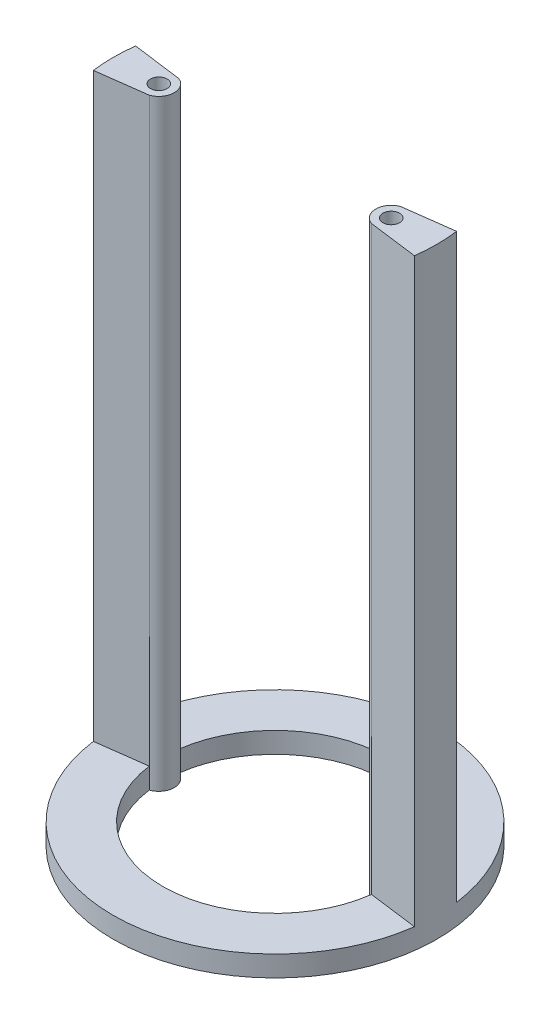
ISO-10303-21;
HEADER;
FILE_DESCRIPTION(('STEP AP214'),'2;1');
FILE_NAME('part.step','',(''),(''),'','','');
FILE_SCHEMA(('AUTOMOTIVE_DESIGN { 1 0 10303 214 1 1 1 1 }'));
ENDSEC;
DATA;
#1=APPLICATION_CONTEXT('core data for automotive mechanical design processes');
#2=APPLICATION_PROTOCOL_DEFINITION('international standard','automotive_design',2000,#1);
#3=PRODUCT_CONTEXT('',#1,'mechanical');
#4=PRODUCT('Part','Part','',(#3));
#5=PRODUCT_RELATED_PRODUCT_CATEGORY('part','',(#4));
#6=PRODUCT_DEFINITION_FORMATION('','',#4);
#7=PRODUCT_DEFINITION_CONTEXT('part definition',#1,'design');
#8=PRODUCT_DEFINITION('design','',#6,#7);
#9=PRODUCT_DEFINITION_SHAPE('','',#8);
#10=(LENGTH_UNIT() NAMED_UNIT(*) SI_UNIT(.MILLI.,.METRE.));
#11=(NAMED_UNIT(*) PLANE_ANGLE_UNIT() SI_UNIT($,.RADIAN.));
#12=(NAMED_UNIT(*) SI_UNIT($,.STERADIAN.) SOLID_ANGLE_UNIT());
#13=UNCERTAINTY_MEASURE_WITH_UNIT(LENGTH_MEASURE(1.E-05),#10,'distance_accuracy_value','');
#14=(GEOMETRIC_REPRESENTATION_CONTEXT(3) GLOBAL_UNCERTAINTY_ASSIGNED_CONTEXT((#13)) GLOBAL_UNIT_ASSIGNED_CONTEXT((#10,
#11,#12)) REPRESENTATION_CONTEXT('',''));
#15=CARTESIAN_POINT('',(0.,0.,0.));
#16=DIRECTION('',(0.,0.,1.));
#17=DIRECTION('',(1.,0.,0.));
#18=AXIS2_PLACEMENT_3D('',#15,#16,#17);
#19=CARTESIAN_POINT('',(0.,0.,0.));
#20=DIRECTION('',(0.,1.,0.));
#21=DIRECTION('',(0.,0.,1.));
#22=AXIS2_PLACEMENT_3D('',#19,#20,#21);
#23=PLANE('',#22);
#24=CARTESIAN_POINT('',(0.,0.,0.));
#25=DIRECTION('',(0.,1.,0.));
#26=DIRECTION('',(0.,0.,1.));
#27=AXIS2_PLACEMENT_3D('',#24,#25,#26);
#28=CIRCLE('',#27,49.53);
#29=CARTESIAN_POINT('',(0.,0.,49.53));
#30=VERTEX_POINT('',#29);
#31=EDGE_CURVE('E38',#30,#30,#28,.T.);
#32=ORIENTED_EDGE('',*,*,#31,.F.);
#33=EDGE_LOOP('',(#32));
#34=FACE_BOUND('',#33,.T.);
#35=CARTESIAN_POINT('',(0.,0.,0.));
#36=DIRECTION('',(0.,1.,0.));
#37=DIRECTION('',(0.,0.,1.));
#38=AXIS2_PLACEMENT_3D('',#35,#36,#37);
#39=CIRCLE('',#38,34.29);
#40=CARTESIAN_POINT('',(-33.996644296508,0.,4.47574313122558));
#41=VERTEX_POINT('',#40);
#42=CARTESIAN_POINT('',(33.996644296508,0.,4.47574313122558));
#43=VERTEX_POINT('',#42);
#44=EDGE_CURVE('E172',#41,#43,#39,.T.);
#45=ORIENTED_EDGE('',*,*,#44,.T.);
#46=CARTESIAN_POINT('',(35.56,0.,0.));
#47=DIRECTION('',(0.,1.,0.));
#48=DIRECTION('',(0.,0.,-1.));
#49=AXIS2_PLACEMENT_3D('',#46,#47,#48);
#50=CIRCLE('',#49,4.74092371087682);
#51=CARTESIAN_POINT('',(33.996644296508,0.,-4.47574313122558));
#52=VERTEX_POINT('',#51);
#53=EDGE_CURVE('E183',#52,#43,#50,.T.);
#54=ORIENTED_EDGE('',*,*,#53,.F.);
#55=CARTESIAN_POINT('',(-33.996644296508,0.,-4.47574313122558));
#56=VERTEX_POINT('',#55);
#57=EDGE_CURVE('E58',#52,#56,#39,.T.);
#58=ORIENTED_EDGE('',*,*,#57,.T.);
#59=CARTESIAN_POINT('',(-35.56,0.,0.));
#60=DIRECTION('',(0.,1.,0.));
#61=DIRECTION('',(0.,0.,1.));
#62=AXIS2_PLACEMENT_3D('',#59,#60,#61);
#63=CIRCLE('',#62,4.74092371087682);
#64=EDGE_CURVE('E182',#41,#56,#63,.T.);
#65=ORIENTED_EDGE('',*,*,#64,.F.);
#66=EDGE_LOOP('',(#45,#54,#58,#65));
#67=FACE_BOUND('',#66,.T.);
#68=CARTESIAN_POINT('',(-35.56,0.,0.));
#69=DIRECTION('',(0.,-1.,0.));
#70=DIRECTION('',(0.,0.,-1.));
#71=AXIS2_PLACEMENT_3D('',#68,#69,#70);
#72=CIRCLE('',#71,2.5527);
#73=CARTESIAN_POINT('',(-35.56,0.,-2.5527));
#74=VERTEX_POINT('',#73);
#75=EDGE_CURVE('E190',#74,#74,#72,.T.);
#76=ORIENTED_EDGE('',*,*,#75,.F.);
#77=EDGE_LOOP('',(#76));
#78=FACE_BOUND('',#77,.T.);
#79=CARTESIAN_POINT('',(35.56,0.,0.));
#80=DIRECTION('',(0.,1.,0.));
#81=DIRECTION('',(0.,0.,1.));
#82=AXIS2_PLACEMENT_3D('',#79,#80,#81);
#83=CIRCLE('',#82,2.5527);
#84=CARTESIAN_POINT('',(35.56,0.,2.5527));
#85=VERTEX_POINT('',#84);
#86=EDGE_CURVE('E201',#85,#85,#83,.T.);
#87=ORIENTED_EDGE('',*,*,#86,.T.);
#88=EDGE_LOOP('',(#87));
#89=FACE_BOUND('',#88,.T.);
#90=ADVANCED_FACE('F34',(#34,#67,#78,#89),#23,.F.);
#91=CARTESIAN_POINT('',(0.,6.35,0.));
#92=DIRECTION('',(0.,-1.,0.));
#93=DIRECTION('',(0.,0.,-1.));
#94=AXIS2_PLACEMENT_3D('',#91,#92,#93);
#95=CYLINDRICAL_SURFACE('',#94,34.29);
#96=DIRECTION('',(0.,1.,0.));
#97=VECTOR('',#96,1.);
#98=CARTESIAN_POINT('',(33.996644296508,0.,4.47574313122558));
#99=LINE('',#98,#97);
#100=CARTESIAN_POINT('',(33.996644296508,6.35,4.47574313122558));
#101=VERTEX_POINT('',#100);
#102=EDGE_CURVE('E50',#43,#101,#99,.T.);
#103=ORIENTED_EDGE('',*,*,#102,.F.);
#104=ORIENTED_EDGE('',*,*,#44,.F.);
#105=DIRECTION('',(0.,1.,0.));
#106=VECTOR('',#105,1.);
#107=CARTESIAN_POINT('',(-33.996644296508,0.,4.47574313122558));
#108=LINE('',#107,#106);
#109=CARTESIAN_POINT('',(-33.996644296508,6.35,4.47574313122558));
#110=VERTEX_POINT('',#109);
#111=EDGE_CURVE('E191',#41,#110,#108,.T.);
#112=ORIENTED_EDGE('',*,*,#111,.T.);
#113=CARTESIAN_POINT('',(0.,6.35,0.));
#114=DIRECTION('',(0.,1.,0.));
#115=DIRECTION('',(0.,0.,1.));
#116=AXIS2_PLACEMENT_3D('',#113,#114,#115);
#117=CIRCLE('',#116,34.29);
#118=EDGE_CURVE('E175',#110,#101,#117,.T.);
#119=ORIENTED_EDGE('',*,*,#118,.T.);
#120=EDGE_LOOP('',(#103,#104,#112,#119));
#121=FACE_BOUND('',#120,.T.);
#122=ADVANCED_FACE('F225',(#121),#95,.F.);
#123=DIRECTION('',(0.,1.,0.));
#124=VECTOR('',#123,1.);
#125=CARTESIAN_POINT('',(33.996644296508,0.,-4.47574313122558));
#126=LINE('',#125,#124);
#127=CARTESIAN_POINT('',(33.996644296508,6.35,-4.47574313122557));
#128=VERTEX_POINT('',#127);
#129=EDGE_CURVE('E197',#52,#128,#126,.T.);
#130=ORIENTED_EDGE('',*,*,#129,.T.);
#131=CARTESIAN_POINT('',(-33.996644296508,6.35,-4.47574313122558));
#132=VERTEX_POINT('',#131);
#133=EDGE_CURVE('E173',#128,#132,#117,.T.);
#134=ORIENTED_EDGE('',*,*,#133,.T.);
#135=DIRECTION('',(0.,1.,0.));
#136=VECTOR('',#135,1.);
#137=CARTESIAN_POINT('',(-33.996644296508,0.,-4.47574313122558));
#138=LINE('',#137,#136);
#139=EDGE_CURVE('E185',#56,#132,#138,.T.);
#140=ORIENTED_EDGE('',*,*,#139,.F.);
#141=ORIENTED_EDGE('',*,*,#57,.F.);
#142=EDGE_LOOP('',(#130,#134,#140,#141));
#143=FACE_BOUND('',#142,.T.);
#144=ADVANCED_FACE('F186',(#143),#95,.F.);
#145=CARTESIAN_POINT('',(0.,6.35,0.));
#146=DIRECTION('',(0.,1.,0.));
#147=DIRECTION('',(0.,0.,1.));
#148=AXIS2_PLACEMENT_3D('',#145,#146,#147);
#149=PLANE('',#148);
#150=ORIENTED_EDGE('',*,*,#133,.F.);
#151=DIRECTION('',(-0.99144486137381,0.,0.130526192220052));
#152=VECTOR('',#151,1.);
#153=CARTESIAN_POINT('',(33.996644296508,6.35,-4.47574313122558));
#154=LINE('',#153,#152);
#155=CARTESIAN_POINT('',(49.1062639838448,6.35,-6.46496230065917));
#156=VERTEX_POINT('',#155);
#157=EDGE_CURVE('E208',#156,#128,#154,.T.);
#158=ORIENTED_EDGE('',*,*,#157,.F.);
#159=CARTESIAN_POINT('',(0.,6.35,0.));
#160=DIRECTION('',(0.,1.,0.));
#161=DIRECTION('',(0.,0.,1.));
#162=AXIS2_PLACEMENT_3D('',#159,#160,#161);
#163=CIRCLE('',#162,49.53);
#164=CARTESIAN_POINT('',(-49.1062639838448,6.35,-6.46496230065917));
#165=VERTEX_POINT('',#164);
#166=EDGE_CURVE('E43',#156,#165,#163,.T.);
#167=ORIENTED_EDGE('',*,*,#166,.T.);
#168=DIRECTION('',(-0.99144486137381,0.,-0.130526192220052));
#169=VECTOR('',#168,1.);
#170=CARTESIAN_POINT('',(-49.1062639838448,6.35,-6.46496230065917));
#171=LINE('',#170,#169);
#172=EDGE_CURVE('E152',#132,#165,#171,.T.);
#173=ORIENTED_EDGE('',*,*,#172,.F.);
#174=EDGE_LOOP('',(#150,#158,#167,#173));
#175=FACE_BOUND('',#174,.T.);
#176=ADVANCED_FACE('F230',(#175),#149,.T.);
#177=CARTESIAN_POINT('',(-49.1062639838448,6.35,6.46496230065917));
#178=VERTEX_POINT('',#177);
#179=CARTESIAN_POINT('',(49.1062639838448,6.35,6.46496230065917));
#180=VERTEX_POINT('',#179);
#181=EDGE_CURVE('E11',#178,#180,#163,.T.);
#182=ORIENTED_EDGE('',*,*,#181,.T.);
#183=DIRECTION('',(0.99144486137381,0.,0.130526192220052));
#184=VECTOR('',#183,1.);
#185=CARTESIAN_POINT('',(33.996644296508,6.35,4.47574313122558));
#186=LINE('',#185,#184);
#187=EDGE_CURVE('E134',#101,#180,#186,.T.);
#188=ORIENTED_EDGE('',*,*,#187,.F.);
#189=ORIENTED_EDGE('',*,*,#118,.F.);
#190=DIRECTION('',(0.99144486137381,0.,-0.130526192220052));
#191=VECTOR('',#190,1.);
#192=CARTESIAN_POINT('',(-33.996644296508,6.35,4.47574313122558));
#193=LINE('',#192,#191);
#194=EDGE_CURVE('E142',#178,#110,#193,.T.);
#195=ORIENTED_EDGE('',*,*,#194,.F.);
#196=EDGE_LOOP('',(#182,#188,#189,#195));
#197=FACE_BOUND('',#196,.T.);
#198=ADVANCED_FACE('F222',(#197),#149,.T.);
#199=CARTESIAN_POINT('',(0.,6.35,0.));
#200=DIRECTION('',(0.,-1.,0.));
#201=DIRECTION('',(0.,0.,-1.));
#202=AXIS2_PLACEMENT_3D('',#199,#200,#201);
#203=CYLINDRICAL_SURFACE('',#202,49.53);
#204=DIRECTION('',(0.,-1.,0.));
#205=VECTOR('',#204,1.);
#206=CARTESIAN_POINT('',(49.1062639838448,184.15,6.46496230065917));
#207=LINE('',#206,#205);
#208=CARTESIAN_POINT('',(49.1062639838448,184.15,6.46496230065917));
#209=VERTEX_POINT('',#208);
#210=EDGE_CURVE('E212',#209,#180,#207,.T.);
#211=ORIENTED_EDGE('',*,*,#210,.T.);
#212=ORIENTED_EDGE('',*,*,#181,.F.);
#213=DIRECTION('',(0.,-1.,0.));
#214=VECTOR('',#213,1.);
#215=CARTESIAN_POINT('',(-49.1062639838448,184.15,6.46496230065917));
#216=LINE('',#215,#214);
#217=CARTESIAN_POINT('',(-49.1062639838448,184.15,6.46496230065917));
#218=VERTEX_POINT('',#217);
#219=EDGE_CURVE('E170',#218,#178,#216,.T.);
#220=ORIENTED_EDGE('',*,*,#219,.F.);
#221=CARTESIAN_POINT('',(0.,184.15,0.));
#222=DIRECTION('',(0.,1.,0.));
#223=DIRECTION('',(0.,0.,-1.));
#224=AXIS2_PLACEMENT_3D('',#221,#222,#223);
#225=CIRCLE('',#224,49.53);
#226=CARTESIAN_POINT('',(-49.1062639838448,184.15,-6.46496230065917));
#227=VERTEX_POINT('',#226);
#228=EDGE_CURVE('E148',#227,#218,#225,.T.);
#229=ORIENTED_EDGE('',*,*,#228,.F.);
#230=DIRECTION('',(0.,-1.,0.));
#231=VECTOR('',#230,1.);
#232=CARTESIAN_POINT('',(-49.1062639838448,184.15,-6.46496230065917));
#233=LINE('',#232,#231);
#234=EDGE_CURVE('E158',#227,#165,#233,.T.);
#235=ORIENTED_EDGE('',*,*,#234,.T.);
#236=ORIENTED_EDGE('',*,*,#166,.F.);
#237=DIRECTION('',(0.,-1.,0.));
#238=VECTOR('',#237,1.);
#239=CARTESIAN_POINT('',(49.1062639838448,184.15,-6.46496230065917));
#240=LINE('',#239,#238);
#241=CARTESIAN_POINT('',(49.1062639838448,184.15,-6.46496230065917));
#242=VERTEX_POINT('',#241);
#243=EDGE_CURVE('E117',#242,#156,#240,.T.);
#244=ORIENTED_EDGE('',*,*,#243,.F.);
#245=CARTESIAN_POINT('',(0.,184.15,0.));
#246=DIRECTION('',(0.,1.,0.));
#247=DIRECTION('',(0.,0.,1.));
#248=AXIS2_PLACEMENT_3D('',#245,#246,#247);
#249=CIRCLE('',#248,49.53);
#250=EDGE_CURVE('E124',#209,#242,#249,.T.);
#251=ORIENTED_EDGE('',*,*,#250,.F.);
#252=EDGE_LOOP('',(#211,#212,#220,#229,#235,#236,#244,#251));
#253=FACE_BOUND('',#252,.T.);
#254=ORIENTED_EDGE('',*,*,#31,.T.);
#255=EDGE_LOOP('',(#254));
#256=FACE_BOUND('',#255,.T.);
#257=ADVANCED_FACE('F36',(#253,#256),#203,.T.);
#258=CARTESIAN_POINT('',(0.,184.15,0.));
#259=DIRECTION('',(0.,-1.,0.));
#260=DIRECTION('',(0.,0.,-1.));
#261=AXIS2_PLACEMENT_3D('',#258,#259,#260);
#262=PLANE('',#261);
#263=ORIENTED_EDGE('',*,*,#228,.T.);
#264=DIRECTION('',(0.99144486137381,0.,-0.130526192220052));
#265=VECTOR('',#264,1.);
#266=CARTESIAN_POINT('',(-33.996644296508,184.15,4.47574313122558));
#267=LINE('',#266,#265);
#268=CARTESIAN_POINT('',(-33.996644296508,184.15,4.47574313122558));
#269=VERTEX_POINT('',#268);
#270=EDGE_CURVE('E151',#218,#269,#267,.T.);
#271=ORIENTED_EDGE('',*,*,#270,.T.);
#272=CARTESIAN_POINT('',(-35.56,184.15,0.));
#273=DIRECTION('',(0.,1.,0.));
#274=DIRECTION('',(0.,0.,1.));
#275=AXIS2_PLACEMENT_3D('',#272,#273,#274);
#276=CIRCLE('',#275,4.74092371087682);
#277=CARTESIAN_POINT('',(-33.996644296508,184.15,-4.47574313122558));
#278=VERTEX_POINT('',#277);
#279=EDGE_CURVE('E154',#269,#278,#276,.T.);
#280=ORIENTED_EDGE('',*,*,#279,.T.);
#281=DIRECTION('',(-0.99144486137381,0.,-0.130526192220052));
#282=VECTOR('',#281,1.);
#283=CARTESIAN_POINT('',(-49.1062639838448,184.15,-6.46496230065917));
#284=LINE('',#283,#282);
#285=EDGE_CURVE('E156',#278,#227,#284,.T.);
#286=ORIENTED_EDGE('',*,*,#285,.T.);
#287=EDGE_LOOP('',(#263,#271,#280,#286));
#288=FACE_BOUND('',#287,.T.);
#289=CARTESIAN_POINT('',(-35.56,184.15,0.));
#290=DIRECTION('',(0.,1.,0.));
#291=DIRECTION('',(0.,0.,1.));
#292=AXIS2_PLACEMENT_3D('',#289,#290,#291);
#293=CIRCLE('',#292,2.5527);
#294=CARTESIAN_POINT('',(-35.56,184.15,2.5527));
#295=VERTEX_POINT('',#294);
#296=EDGE_CURVE('E139',#295,#295,#293,.T.);
#297=ORIENTED_EDGE('',*,*,#296,.F.);
#298=EDGE_LOOP('',(#297));
#299=FACE_BOUND('',#298,.T.);
#300=ADVANCED_FACE('F238',(#288,#299),#262,.F.);
#301=CARTESIAN_POINT('',(-33.996644296508,184.15,4.47574313122558));
#302=DIRECTION('',(-0.130526192220052,0.,-0.99144486137381));
#303=DIRECTION('',(-0.99144486137381,0.,0.130526192220052));
#304=AXIS2_PLACEMENT_3D('',#301,#302,#303);
#305=PLANE('',#304);
#306=ORIENTED_EDGE('',*,*,#194,.T.);
#307=DIRECTION('',(0.,-1.,0.));
#308=VECTOR('',#307,1.);
#309=CARTESIAN_POINT('',(-33.996644296508,184.15,4.47574313122558));
#310=LINE('',#309,#308);
#311=EDGE_CURVE('E167',#269,#110,#310,.T.);
#312=ORIENTED_EDGE('',*,*,#311,.F.);
#313=ORIENTED_EDGE('',*,*,#270,.F.);
#314=ORIENTED_EDGE('',*,*,#219,.T.);
#315=EDGE_LOOP('',(#306,#312,#313,#314));
#316=FACE_BOUND('',#315,.T.);
#317=ADVANCED_FACE('F243',(#316),#305,.F.);
#318=CARTESIAN_POINT('',(-35.56,184.15,0.));
#319=DIRECTION('',(0.,-1.,0.));
#320=DIRECTION('',(0.,0.,-1.));
#321=AXIS2_PLACEMENT_3D('',#318,#319,#320);
#322=CYLINDRICAL_SURFACE('',#321,4.74092371087682);
#323=ORIENTED_EDGE('',*,*,#311,.T.);
#324=ORIENTED_EDGE('',*,*,#111,.F.);
#325=ORIENTED_EDGE('',*,*,#64,.T.);
#326=ORIENTED_EDGE('',*,*,#139,.T.);
#327=DIRECTION('',(0.,-1.,0.));
#328=VECTOR('',#327,1.);
#329=CARTESIAN_POINT('',(-33.996644296508,184.15,-4.47574313122558));
#330=LINE('',#329,#328);
#331=EDGE_CURVE('E164',#278,#132,#330,.T.);
#332=ORIENTED_EDGE('',*,*,#331,.F.);
#333=ORIENTED_EDGE('',*,*,#279,.F.);
#334=EDGE_LOOP('',(#323,#324,#325,#326,#332,#333));
#335=FACE_BOUND('',#334,.T.);
#336=ADVANCED_FACE('F194',(#335),#322,.T.);
#337=CARTESIAN_POINT('',(-49.1062639838448,184.15,-6.46496230065917));
#338=DIRECTION('',(-0.130526192220052,0.,0.99144486137381));
#339=DIRECTION('',(0.99144486137381,0.,0.130526192220052));
#340=AXIS2_PLACEMENT_3D('',#337,#338,#339);
#341=PLANE('',#340);
#342=ORIENTED_EDGE('',*,*,#172,.T.);
#343=ORIENTED_EDGE('',*,*,#234,.F.);
#344=ORIENTED_EDGE('',*,*,#285,.F.);
#345=ORIENTED_EDGE('',*,*,#331,.T.);
#346=EDGE_LOOP('',(#342,#343,#344,#345));
#347=FACE_BOUND('',#346,.T.);
#348=ADVANCED_FACE('F233',(#347),#341,.F.);
#349=CARTESIAN_POINT('',(-35.56,184.15,0.));
#350=DIRECTION('',(0.,-1.,0.));
#351=DIRECTION('',(0.,0.,-1.));
#352=AXIS2_PLACEMENT_3D('',#349,#350,#351);
#353=CYLINDRICAL_SURFACE('',#352,2.5527);
#354=ORIENTED_EDGE('',*,*,#75,.T.);
#355=EDGE_LOOP('',(#354));
#356=FACE_BOUND('',#355,.T.);
#357=ORIENTED_EDGE('',*,*,#296,.T.);
#358=EDGE_LOOP('',(#357));
#359=FACE_BOUND('',#358,.T.);
#360=ADVANCED_FACE('F290',(#356,#359),#353,.F.);
#361=CARTESIAN_POINT('',(0.,184.15,0.));
#362=DIRECTION('',(0.,1.,0.));
#363=DIRECTION('',(0.,0.,1.));
#364=AXIS2_PLACEMENT_3D('',#361,#362,#363);
#365=PLANE('',#364);
#366=ORIENTED_EDGE('',*,*,#250,.T.);
#367=DIRECTION('',(-0.99144486137381,0.,0.130526192220052));
#368=VECTOR('',#367,1.);
#369=CARTESIAN_POINT('',(33.996644296508,184.15,-4.47574313122558));
#370=LINE('',#369,#368);
#371=CARTESIAN_POINT('',(33.996644296508,184.15,-4.47574313122558));
#372=VERTEX_POINT('',#371);
#373=EDGE_CURVE('E112',#242,#372,#370,.T.);
#374=ORIENTED_EDGE('',*,*,#373,.T.);
#375=CARTESIAN_POINT('',(35.56,184.15,0.));
#376=DIRECTION('',(0.,1.,0.));
#377=DIRECTION('',(0.,0.,-1.));
#378=AXIS2_PLACEMENT_3D('',#375,#376,#377);
#379=CIRCLE('',#378,4.74092371087682);
#380=CARTESIAN_POINT('',(33.996644296508,184.15,4.47574313122558));
#381=VERTEX_POINT('',#380);
#382=EDGE_CURVE('E123',#372,#381,#379,.T.);
#383=ORIENTED_EDGE('',*,*,#382,.T.);
#384=DIRECTION('',(0.99144486137381,0.,0.130526192220052));
#385=VECTOR('',#384,1.);
#386=CARTESIAN_POINT('',(33.996644296508,184.15,4.47574313122558));
#387=LINE('',#386,#385);
#388=EDGE_CURVE('E130',#381,#209,#387,.T.);
#389=ORIENTED_EDGE('',*,*,#388,.T.);
#390=EDGE_LOOP('',(#366,#374,#383,#389));
#391=FACE_BOUND('',#390,.T.);
#392=CARTESIAN_POINT('',(35.56,184.15,0.));
#393=DIRECTION('',(0.,1.,0.));
#394=DIRECTION('',(0.,0.,-1.));
#395=AXIS2_PLACEMENT_3D('',#392,#393,#394);
#396=CIRCLE('',#395,2.5527);
#397=CARTESIAN_POINT('',(35.56,184.15,-2.5527));
#398=VERTEX_POINT('',#397);
#399=EDGE_CURVE('E204',#398,#398,#396,.T.);
#400=ORIENTED_EDGE('',*,*,#399,.F.);
#401=EDGE_LOOP('',(#400));
#402=FACE_BOUND('',#401,.T.);
#403=ADVANCED_FACE('F127',(#391,#402),#365,.T.);
#404=CARTESIAN_POINT('',(33.996644296508,184.15,-4.47574313122558));
#405=DIRECTION('',(0.130526192220052,0.,0.99144486137381));
#406=DIRECTION('',(0.99144486137381,0.,-0.130526192220052));
#407=AXIS2_PLACEMENT_3D('',#404,#405,#406);
#408=PLANE('',#407);
#409=ORIENTED_EDGE('',*,*,#157,.T.);
#410=DIRECTION('',(0.,-1.,0.));
#411=VECTOR('',#410,1.);
#412=CARTESIAN_POINT('',(33.996644296508,184.15,-4.47574313122558));
#413=LINE('',#412,#411);
#414=EDGE_CURVE('E120',#372,#128,#413,.T.);
#415=ORIENTED_EDGE('',*,*,#414,.F.);
#416=ORIENTED_EDGE('',*,*,#373,.F.);
#417=ORIENTED_EDGE('',*,*,#243,.T.);
#418=EDGE_LOOP('',(#409,#415,#416,#417));
#419=FACE_BOUND('',#418,.T.);
#420=ADVANCED_FACE('F115',(#419),#408,.F.);
#421=CARTESIAN_POINT('',(35.56,184.15,0.));
#422=DIRECTION('',(0.,-1.,0.));
#423=DIRECTION('',(0.,0.,-1.));
#424=AXIS2_PLACEMENT_3D('',#421,#422,#423);
#425=CYLINDRICAL_SURFACE('',#424,4.74092371087682);
#426=ORIENTED_EDGE('',*,*,#414,.T.);
#427=ORIENTED_EDGE('',*,*,#129,.F.);
#428=ORIENTED_EDGE('',*,*,#53,.T.);
#429=ORIENTED_EDGE('',*,*,#102,.T.);
#430=DIRECTION('',(0.,-1.,0.));
#431=VECTOR('',#430,1.);
#432=CARTESIAN_POINT('',(33.996644296508,184.15,4.47574313122558));
#433=LINE('',#432,#431);
#434=EDGE_CURVE('E144',#381,#101,#433,.T.);
#435=ORIENTED_EDGE('',*,*,#434,.F.);
#436=ORIENTED_EDGE('',*,*,#382,.F.);
#437=EDGE_LOOP('',(#426,#427,#428,#429,#435,#436));
#438=FACE_BOUND('',#437,.T.);
#439=ADVANCED_FACE('F226',(#438),#425,.T.);
#440=CARTESIAN_POINT('',(33.996644296508,184.15,4.47574313122558));
#441=DIRECTION('',(0.130526192220052,0.,-0.99144486137381));
#442=DIRECTION('',(-0.99144486137381,0.,-0.130526192220052));
#443=AXIS2_PLACEMENT_3D('',#440,#441,#442);
#444=PLANE('',#443);
#445=ORIENTED_EDGE('',*,*,#187,.T.);
#446=ORIENTED_EDGE('',*,*,#210,.F.);
#447=ORIENTED_EDGE('',*,*,#388,.F.);
#448=ORIENTED_EDGE('',*,*,#434,.T.);
#449=EDGE_LOOP('',(#445,#446,#447,#448));
#450=FACE_BOUND('',#449,.T.);
#451=ADVANCED_FACE('F218',(#450),#444,.F.);
#452=CARTESIAN_POINT('',(35.56,184.15,0.));
#453=DIRECTION('',(0.,-1.,0.));
#454=DIRECTION('',(0.,0.,-1.));
#455=AXIS2_PLACEMENT_3D('',#452,#453,#454);
#456=CYLINDRICAL_SURFACE('',#455,2.5527);
#457=ORIENTED_EDGE('',*,*,#86,.F.);
#458=EDGE_LOOP('',(#457));
#459=FACE_BOUND('',#458,.T.);
#460=ORIENTED_EDGE('',*,*,#399,.T.);
#461=EDGE_LOOP('',(#460));
#462=FACE_BOUND('',#461,.T.);
#463=ADVANCED_FACE('F361',(#459,#462),#456,.F.);
#464=CLOSED_SHELL('',(#90,#122,#144,#176,#198,#257,#300,#317,#336,#348,#360,#403,#420,#439,#451,#463));
#465=MANIFOLD_SOLID_BREP('B2',#464);
#466=ADVANCED_BREP_SHAPE_REPRESENTATION('',(#18,#465),#14);
#467=SHAPE_DEFINITION_REPRESENTATION(#9,#466);
ENDSEC;
END-ISO-10303-21;
